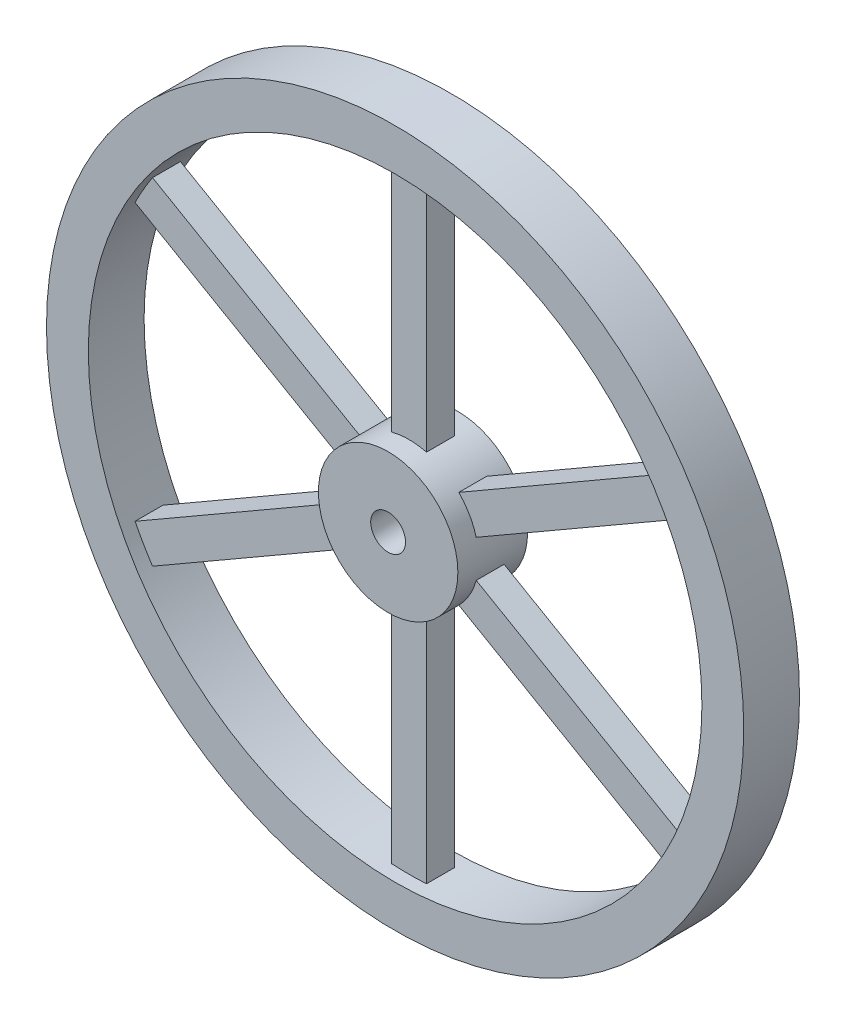
ISO-10303-21;
HEADER;
FILE_DESCRIPTION(('STEP AP214'),'2;1');
FILE_NAME('part.step','',(''),(''),'','','');
FILE_SCHEMA(('AUTOMOTIVE_DESIGN { 1 0 10303 214 1 1 1 1 }'));
ENDSEC;
DATA;
#1=APPLICATION_CONTEXT('core data for automotive mechanical design processes');
#2=APPLICATION_PROTOCOL_DEFINITION('international standard','automotive_design',2000,#1);
#3=PRODUCT_CONTEXT('',#1,'mechanical');
#4=PRODUCT('Part','Part','',(#3));
#5=PRODUCT_RELATED_PRODUCT_CATEGORY('part','',(#4));
#6=PRODUCT_DEFINITION_FORMATION('','',#4);
#7=PRODUCT_DEFINITION_CONTEXT('part definition',#1,'design');
#8=PRODUCT_DEFINITION('design','',#6,#7);
#9=PRODUCT_DEFINITION_SHAPE('','',#8);
#10=(LENGTH_UNIT() NAMED_UNIT(*) SI_UNIT(.MILLI.,.METRE.));
#11=(NAMED_UNIT(*) PLANE_ANGLE_UNIT() SI_UNIT($,.RADIAN.));
#12=(NAMED_UNIT(*) SI_UNIT($,.STERADIAN.) SOLID_ANGLE_UNIT());
#13=UNCERTAINTY_MEASURE_WITH_UNIT(LENGTH_MEASURE(1.E-05),#10,'distance_accuracy_value','');
#14=(GEOMETRIC_REPRESENTATION_CONTEXT(3) GLOBAL_UNCERTAINTY_ASSIGNED_CONTEXT((#13)) GLOBAL_UNIT_ASSIGNED_CONTEXT((#10,
#11,#12)) REPRESENTATION_CONTEXT('',''));
#15=CARTESIAN_POINT('',(0.,0.,0.));
#16=DIRECTION('',(0.,0.,1.));
#17=DIRECTION('',(1.,0.,0.));
#18=AXIS2_PLACEMENT_3D('',#15,#16,#17);
#19=CARTESIAN_POINT('',(-2.5,45.,2.));
#20=DIRECTION('',(1.,0.,0.));
#21=DIRECTION('',(0.,0.,-1.));
#22=AXIS2_PLACEMENT_3D('',#19,#20,#21);
#23=PLANE('',#22);
#24=DIRECTION('',(0.,0.,-1.));
#25=VECTOR('',#24,1.);
#26=CARTESIAN_POINT('',(-2.5,9.68245836551854,5.));
#27=LINE('',#26,#25);
#28=CARTESIAN_POINT('',(-2.5,9.68245836551854,2.));
#29=VERTEX_POINT('',#28);
#30=CARTESIAN_POINT('',(-2.5,9.68245836551854,-2.));
#31=VERTEX_POINT('',#30);
#32=EDGE_CURVE('E306',#29,#31,#27,.T.);
#33=ORIENTED_EDGE('',*,*,#32,.F.);
#34=DIRECTION('',(0.,-1.,0.));
#35=VECTOR('',#34,1.);
#36=CARTESIAN_POINT('',(-2.5,45.,2.));
#37=LINE('',#36,#35);
#38=CARTESIAN_POINT('',(-2.5,43.9289198592453,2.));
#39=VERTEX_POINT('',#38);
#40=EDGE_CURVE('E315',#39,#29,#37,.T.);
#41=ORIENTED_EDGE('',*,*,#40,.F.);
#42=DIRECTION('',(0.,0.,-1.));
#43=VECTOR('',#42,1.);
#44=CARTESIAN_POINT('',(-2.5,43.9289198592453,4.));
#45=LINE('',#44,#43);
#46=CARTESIAN_POINT('',(-2.5,43.9289198592453,-2.));
#47=VERTEX_POINT('',#46);
#48=EDGE_CURVE('E338',#47,#39,#45,.F.);
#49=ORIENTED_EDGE('',*,*,#48,.F.);
#50=DIRECTION('',(0.,-1.,0.));
#51=VECTOR('',#50,1.);
#52=CARTESIAN_POINT('',(-2.5,45.,-2.));
#53=LINE('',#52,#51);
#54=EDGE_CURVE('E313',#47,#31,#53,.T.);
#55=ORIENTED_EDGE('',*,*,#54,.T.);
#56=EDGE_LOOP('',(#33,#41,#49,#55));
#57=FACE_BOUND('',#56,.T.);
#58=ADVANCED_FACE('F41',(#57),#23,.F.);
#59=CARTESIAN_POINT('',(2.5,9.,2.));
#60=DIRECTION('',(-1.,0.,0.));
#61=DIRECTION('',(0.,0.,1.));
#62=AXIS2_PLACEMENT_3D('',#59,#60,#61);
#63=PLANE('',#62);
#64=DIRECTION('',(0.,0.,-1.));
#65=VECTOR('',#64,1.);
#66=CARTESIAN_POINT('',(2.5,9.68245836551854,5.));
#67=LINE('',#66,#65);
#68=CARTESIAN_POINT('',(2.5,9.68245836551854,-2.));
#69=VERTEX_POINT('',#68);
#70=CARTESIAN_POINT('',(2.5,9.68245836551854,2.));
#71=VERTEX_POINT('',#70);
#72=EDGE_CURVE('E224',#69,#71,#67,.F.);
#73=ORIENTED_EDGE('',*,*,#72,.F.);
#74=DIRECTION('',(0.,1.,0.));
#75=VECTOR('',#74,1.);
#76=CARTESIAN_POINT('',(2.5,9.,-2.));
#77=LINE('',#76,#75);
#78=CARTESIAN_POINT('',(2.5,43.9289198592453,-2.));
#79=VERTEX_POINT('',#78);
#80=EDGE_CURVE('E316',#69,#79,#77,.T.);
#81=ORIENTED_EDGE('',*,*,#80,.T.);
#82=DIRECTION('',(0.,0.,-1.));
#83=VECTOR('',#82,1.);
#84=CARTESIAN_POINT('',(2.5,43.9289198592453,4.));
#85=LINE('',#84,#83);
#86=CARTESIAN_POINT('',(2.5,43.9289198592453,2.));
#87=VERTEX_POINT('',#86);
#88=EDGE_CURVE('E339',#87,#79,#85,.T.);
#89=ORIENTED_EDGE('',*,*,#88,.F.);
#90=DIRECTION('',(0.,1.,0.));
#91=VECTOR('',#90,1.);
#92=CARTESIAN_POINT('',(2.5,9.,2.));
#93=LINE('',#92,#91);
#94=EDGE_CURVE('E312',#71,#87,#93,.T.);
#95=ORIENTED_EDGE('',*,*,#94,.F.);
#96=EDGE_LOOP('',(#73,#81,#89,#95));
#97=FACE_BOUND('',#96,.T.);
#98=ADVANCED_FACE('F429',(#97),#63,.F.);
#99=CARTESIAN_POINT('',(0.,0.,4.));
#100=DIRECTION('',(0.,0.,1.));
#101=DIRECTION('',(1.,0.,0.));
#102=AXIS2_PLACEMENT_3D('',#99,#100,#101);
#103=PLANE('',#102);
#104=CARTESIAN_POINT('',(0.,0.,4.));
#105=DIRECTION('',(0.,0.,1.));
#106=DIRECTION('',(1.,0.,0.));
#107=AXIS2_PLACEMENT_3D('',#104,#105,#106);
#108=CIRCLE('',#107,50.);
#109=CARTESIAN_POINT('',(50.,0.,4.));
#110=VERTEX_POINT('',#109);
#111=EDGE_CURVE('E327',#110,#110,#108,.T.);
#112=ORIENTED_EDGE('',*,*,#111,.T.);
#113=EDGE_LOOP('',(#112));
#114=FACE_BOUND('',#113,.T.);
#115=CARTESIAN_POINT('',(0.,0.,4.));
#116=DIRECTION('',(0.,0.,1.));
#117=DIRECTION('',(1.,0.,0.));
#118=AXIS2_PLACEMENT_3D('',#115,#116,#117);
#119=CIRCLE('',#118,44.);
#120=CARTESIAN_POINT('',(44.,0.,4.));
#121=VERTEX_POINT('',#120);
#122=EDGE_CURVE('E325',#121,#121,#119,.T.);
#123=ORIENTED_EDGE('',*,*,#122,.F.);
#124=EDGE_LOOP('',(#123));
#125=FACE_BOUND('',#124,.T.);
#126=ADVANCED_FACE('F440',(#114,#125),#103,.T.);
#127=CARTESIAN_POINT('',(0.,0.,-4.));
#128=DIRECTION('',(0.,0.,1.));
#129=DIRECTION('',(1.,0.,0.));
#130=AXIS2_PLACEMENT_3D('',#127,#128,#129);
#131=PLANE('',#130);
#132=CARTESIAN_POINT('',(0.,0.,-4.));
#133=DIRECTION('',(0.,0.,1.));
#134=DIRECTION('',(1.,0.,0.));
#135=AXIS2_PLACEMENT_3D('',#132,#133,#134);
#136=CIRCLE('',#135,50.);
#137=CARTESIAN_POINT('',(50.,0.,-4.));
#138=VERTEX_POINT('',#137);
#139=EDGE_CURVE('E324',#138,#138,#136,.T.);
#140=ORIENTED_EDGE('',*,*,#139,.F.);
#141=EDGE_LOOP('',(#140));
#142=FACE_BOUND('',#141,.T.);
#143=CARTESIAN_POINT('',(0.,0.,-4.));
#144=DIRECTION('',(0.,0.,1.));
#145=DIRECTION('',(1.,0.,0.));
#146=AXIS2_PLACEMENT_3D('',#143,#144,#145);
#147=CIRCLE('',#146,44.);
#148=CARTESIAN_POINT('',(44.,0.,-4.));
#149=VERTEX_POINT('',#148);
#150=EDGE_CURVE('E318',#149,#149,#147,.T.);
#151=ORIENTED_EDGE('',*,*,#150,.T.);
#152=EDGE_LOOP('',(#151));
#153=FACE_BOUND('',#152,.T.);
#154=ADVANCED_FACE('F446',(#142,#153),#131,.F.);
#155=CARTESIAN_POINT('',(0.,0.,4.));
#156=DIRECTION('',(0.,0.,-1.));
#157=DIRECTION('',(-1.,0.,0.));
#158=AXIS2_PLACEMENT_3D('',#155,#156,#157);
#159=CYLINDRICAL_SURFACE('',#158,50.);
#160=ORIENTED_EDGE('',*,*,#111,.F.);
#161=EDGE_LOOP('',(#160));
#162=FACE_BOUND('',#161,.T.);
#163=ORIENTED_EDGE('',*,*,#139,.T.);
#164=EDGE_LOOP('',(#163));
#165=FACE_BOUND('',#164,.T.);
#166=ADVANCED_FACE('F43',(#162,#165),#159,.T.);
#167=CARTESIAN_POINT('',(0.,0.,4.));
#168=DIRECTION('',(0.,0.,-1.));
#169=DIRECTION('',(-1.,0.,0.));
#170=AXIS2_PLACEMENT_3D('',#167,#168,#169);
#171=CYLINDRICAL_SURFACE('',#170,44.);
#172=CARTESIAN_POINT('',(0.,0.,2.));
#173=DIRECTION('',(0.,0.,1.));
#174=DIRECTION('',(1.,0.,0.));
#175=AXIS2_PLACEMENT_3D('',#172,#173,#174);
#176=CIRCLE('',#175,44.);
#177=CARTESIAN_POINT('',(39.2935605589172,19.7993964201615,2.));
#178=VERTEX_POINT('',#177);
#179=CARTESIAN_POINT('',(36.7935605589172,24.1295234390837,2.));
#180=VERTEX_POINT('',#179);
#181=EDGE_CURVE('E283',#178,#180,#176,.T.);
#182=ORIENTED_EDGE('',*,*,#181,.F.);
#183=DIRECTION('',(0.,0.,-1.));
#184=VECTOR('',#183,1.);
#185=CARTESIAN_POINT('',(39.2935605589172,19.7993964201615,4.));
#186=LINE('',#185,#184);
#187=CARTESIAN_POINT('',(39.2935605589172,19.7993964201615,-2.));
#188=VERTEX_POINT('',#187);
#189=EDGE_CURVE('E287',#178,#188,#186,.T.);
#190=ORIENTED_EDGE('',*,*,#189,.T.);
#191=CARTESIAN_POINT('',(0.,0.,-2.));
#192=DIRECTION('',(0.,0.,1.));
#193=DIRECTION('',(1.,0.,0.));
#194=AXIS2_PLACEMENT_3D('',#191,#192,#193);
#195=CIRCLE('',#194,44.);
#196=CARTESIAN_POINT('',(36.7935605589172,24.1295234390837,-2.));
#197=VERTEX_POINT('',#196);
#198=EDGE_CURVE('E284',#188,#197,#195,.T.);
#199=ORIENTED_EDGE('',*,*,#198,.T.);
#200=DIRECTION('',(0.,0.,-1.));
#201=VECTOR('',#200,1.);
#202=CARTESIAN_POINT('',(36.7935605589172,24.1295234390837,4.));
#203=LINE('',#202,#201);
#204=EDGE_CURVE('E286',#197,#180,#203,.F.);
#205=ORIENTED_EDGE('',*,*,#204,.T.);
#206=EDGE_LOOP('',(#182,#190,#199,#205));
#207=FACE_BOUND('',#206,.T.);
#208=CARTESIAN_POINT('',(0.,0.,2.));
#209=DIRECTION('',(0.,0.,1.));
#210=DIRECTION('',(1.,0.,0.));
#211=AXIS2_PLACEMENT_3D('',#208,#209,#210);
#212=CIRCLE('',#211,44.);
#213=CARTESIAN_POINT('',(36.7935605589172,-24.1295234390838,2.));
#214=VERTEX_POINT('',#213);
#215=CARTESIAN_POINT('',(39.2935605589172,-19.7993964201616,2.));
#216=VERTEX_POINT('',#215);
#217=EDGE_CURVE('E272',#214,#216,#212,.T.);
#218=ORIENTED_EDGE('',*,*,#217,.F.);
#219=DIRECTION('',(0.,0.,-1.));
#220=VECTOR('',#219,1.);
#221=CARTESIAN_POINT('',(36.7935605589172,-24.1295234390838,4.));
#222=LINE('',#221,#220);
#223=CARTESIAN_POINT('',(36.7935605589172,-24.1295234390838,-2.));
#224=VERTEX_POINT('',#223);
#225=EDGE_CURVE('E274',#214,#224,#222,.T.);
#226=ORIENTED_EDGE('',*,*,#225,.T.);
#227=CARTESIAN_POINT('',(0.,0.,-2.));
#228=DIRECTION('',(0.,0.,1.));
#229=DIRECTION('',(1.,0.,0.));
#230=AXIS2_PLACEMENT_3D('',#227,#228,#229);
#231=CIRCLE('',#230,44.);
#232=CARTESIAN_POINT('',(39.2935605589172,-19.7993964201616,-2.));
#233=VERTEX_POINT('',#232);
#234=EDGE_CURVE('E269',#224,#233,#231,.T.);
#235=ORIENTED_EDGE('',*,*,#234,.T.);
#236=DIRECTION('',(0.,0.,-1.));
#237=VECTOR('',#236,1.);
#238=CARTESIAN_POINT('',(39.2935605589172,-19.7993964201616,4.));
#239=LINE('',#238,#237);
#240=EDGE_CURVE('E279',#233,#216,#239,.F.);
#241=ORIENTED_EDGE('',*,*,#240,.T.);
#242=EDGE_LOOP('',(#218,#226,#235,#241));
#243=FACE_BOUND('',#242,.T.);
#244=CARTESIAN_POINT('',(0.,0.,2.));
#245=DIRECTION('',(0.,0.,1.));
#246=DIRECTION('',(1.,0.,0.));
#247=AXIS2_PLACEMENT_3D('',#244,#245,#246);
#248=CIRCLE('',#247,44.);
#249=CARTESIAN_POINT('',(-2.50000000000001,-43.9289198592453,2.));
#250=VERTEX_POINT('',#249);
#251=CARTESIAN_POINT('',(2.49999999999999,-43.9289198592453,2.));
#252=VERTEX_POINT('',#251);
#253=EDGE_CURVE('E265',#250,#252,#248,.T.);
#254=ORIENTED_EDGE('',*,*,#253,.F.);
#255=DIRECTION('',(0.,0.,-1.));
#256=VECTOR('',#255,1.);
#257=CARTESIAN_POINT('',(-2.50000000000001,-43.9289198592453,4.));
#258=LINE('',#257,#256);
#259=CARTESIAN_POINT('',(-2.50000000000001,-43.9289198592453,-2.));
#260=VERTEX_POINT('',#259);
#261=EDGE_CURVE('E262',#250,#260,#258,.T.);
#262=ORIENTED_EDGE('',*,*,#261,.T.);
#263=CARTESIAN_POINT('',(0.,0.,-2.));
#264=DIRECTION('',(0.,0.,1.));
#265=DIRECTION('',(1.,0.,0.));
#266=AXIS2_PLACEMENT_3D('',#263,#264,#265);
#267=CIRCLE('',#266,44.);
#268=CARTESIAN_POINT('',(2.49999999999999,-43.9289198592453,-2.));
#269=VERTEX_POINT('',#268);
#270=EDGE_CURVE('E259',#260,#269,#267,.T.);
#271=ORIENTED_EDGE('',*,*,#270,.T.);
#272=DIRECTION('',(0.,0.,-1.));
#273=VECTOR('',#272,1.);
#274=CARTESIAN_POINT('',(2.49999999999999,-43.9289198592453,4.));
#275=LINE('',#274,#273);
#276=EDGE_CURVE('E270',#269,#252,#275,.F.);
#277=ORIENTED_EDGE('',*,*,#276,.T.);
#278=EDGE_LOOP('',(#254,#262,#271,#277));
#279=FACE_BOUND('',#278,.T.);
#280=CARTESIAN_POINT('',(0.,0.,2.));
#281=DIRECTION('',(0.,0.,1.));
#282=DIRECTION('',(1.,0.,0.));
#283=AXIS2_PLACEMENT_3D('',#280,#281,#282);
#284=CIRCLE('',#283,44.);
#285=CARTESIAN_POINT('',(-39.2935605589172,-19.7993964201616,2.));
#286=VERTEX_POINT('',#285);
#287=CARTESIAN_POINT('',(-36.7935605589172,-24.1295234390838,2.));
#288=VERTEX_POINT('',#287);
#289=EDGE_CURVE('E253',#286,#288,#284,.T.);
#290=ORIENTED_EDGE('',*,*,#289,.F.);
#291=DIRECTION('',(0.,0.,-1.));
#292=VECTOR('',#291,1.);
#293=CARTESIAN_POINT('',(-39.2935605589172,-19.7993964201616,4.));
#294=LINE('',#293,#292);
#295=CARTESIAN_POINT('',(-39.2935605589172,-19.7993964201616,-2.));
#296=VERTEX_POINT('',#295);
#297=EDGE_CURVE('E251',#286,#296,#294,.T.);
#298=ORIENTED_EDGE('',*,*,#297,.T.);
#299=CARTESIAN_POINT('',(0.,0.,-2.));
#300=DIRECTION('',(0.,0.,1.));
#301=DIRECTION('',(1.,0.,0.));
#302=AXIS2_PLACEMENT_3D('',#299,#300,#301);
#303=CIRCLE('',#302,44.);
#304=CARTESIAN_POINT('',(-36.7935605589172,-24.1295234390838,-2.));
#305=VERTEX_POINT('',#304);
#306=EDGE_CURVE('E250',#296,#305,#303,.T.);
#307=ORIENTED_EDGE('',*,*,#306,.T.);
#308=DIRECTION('',(0.,0.,-1.));
#309=VECTOR('',#308,1.);
#310=CARTESIAN_POINT('',(-36.7935605589172,-24.1295234390838,4.));
#311=LINE('',#310,#309);
#312=EDGE_CURVE('E258',#305,#288,#311,.F.);
#313=ORIENTED_EDGE('',*,*,#312,.T.);
#314=EDGE_LOOP('',(#290,#298,#307,#313));
#315=FACE_BOUND('',#314,.T.);
#316=CARTESIAN_POINT('',(0.,0.,2.));
#317=DIRECTION('',(0.,0.,1.));
#318=DIRECTION('',(1.,0.,0.));
#319=AXIS2_PLACEMENT_3D('',#316,#317,#318);
#320=CIRCLE('',#319,44.);
#321=CARTESIAN_POINT('',(-36.7935605589172,24.1295234390838,2.));
#322=VERTEX_POINT('',#321);
#323=CARTESIAN_POINT('',(-39.2935605589172,19.7993964201616,2.));
#324=VERTEX_POINT('',#323);
#325=EDGE_CURVE('E241',#322,#324,#320,.T.);
#326=ORIENTED_EDGE('',*,*,#325,.F.);
#327=DIRECTION('',(0.,0.,-1.));
#328=VECTOR('',#327,1.);
#329=CARTESIAN_POINT('',(-36.7935605589172,24.1295234390838,4.));
#330=LINE('',#329,#328);
#331=CARTESIAN_POINT('',(-36.7935605589172,24.1295234390838,-2.));
#332=VERTEX_POINT('',#331);
#333=EDGE_CURVE('E243',#322,#332,#330,.T.);
#334=ORIENTED_EDGE('',*,*,#333,.T.);
#335=CARTESIAN_POINT('',(0.,0.,-2.));
#336=DIRECTION('',(0.,0.,1.));
#337=DIRECTION('',(1.,0.,0.));
#338=AXIS2_PLACEMENT_3D('',#335,#336,#337);
#339=CIRCLE('',#338,44.);
#340=CARTESIAN_POINT('',(-39.2935605589172,19.7993964201616,-2.));
#341=VERTEX_POINT('',#340);
#342=EDGE_CURVE('E238',#332,#341,#339,.T.);
#343=ORIENTED_EDGE('',*,*,#342,.T.);
#344=DIRECTION('',(0.,0.,-1.));
#345=VECTOR('',#344,1.);
#346=CARTESIAN_POINT('',(-39.2935605589172,19.7993964201616,4.));
#347=LINE('',#346,#345);
#348=EDGE_CURVE('E226',#341,#324,#347,.F.);
#349=ORIENTED_EDGE('',*,*,#348,.T.);
#350=EDGE_LOOP('',(#326,#334,#343,#349));
#351=FACE_BOUND('',#350,.T.);
#352=CARTESIAN_POINT('',(0.,0.,2.));
#353=DIRECTION('',(0.,0.,1.));
#354=DIRECTION('',(1.,0.,0.));
#355=AXIS2_PLACEMENT_3D('',#352,#353,#354);
#356=CIRCLE('',#355,44.);
#357=EDGE_CURVE('E344',#87,#39,#356,.T.);
#358=ORIENTED_EDGE('',*,*,#357,.F.);
#359=ORIENTED_EDGE('',*,*,#88,.T.);
#360=CARTESIAN_POINT('',(0.,0.,-2.));
#361=DIRECTION('',(0.,0.,1.));
#362=DIRECTION('',(1.,0.,0.));
#363=AXIS2_PLACEMENT_3D('',#360,#361,#362);
#364=CIRCLE('',#363,44.);
#365=EDGE_CURVE('E332',#79,#47,#364,.T.);
#366=ORIENTED_EDGE('',*,*,#365,.T.);
#367=ORIENTED_EDGE('',*,*,#48,.T.);
#368=EDGE_LOOP('',(#358,#359,#366,#367));
#369=FACE_BOUND('',#368,.T.);
#370=ORIENTED_EDGE('',*,*,#122,.T.);
#371=EDGE_LOOP('',(#370));
#372=FACE_BOUND('',#371,.T.);
#373=ORIENTED_EDGE('',*,*,#150,.F.);
#374=EDGE_LOOP('',(#373));
#375=FACE_BOUND('',#374,.T.);
#376=ADVANCED_FACE('F418',(#207,#243,#279,#315,#351,#369,#372,#375),#171,.F.);
#377=CARTESIAN_POINT('',(0.,0.,2.));
#378=DIRECTION('',(0.,0.,1.));
#379=DIRECTION('',(1.,0.,0.));
#380=AXIS2_PLACEMENT_3D('',#377,#378,#379);
#381=PLANE('',#380);
#382=ORIENTED_EDGE('',*,*,#40,.T.);
#383=CARTESIAN_POINT('',(0.,0.,2.));
#384=DIRECTION('',(0.,0.,1.));
#385=DIRECTION('',(1.,0.,0.));
#386=AXIS2_PLACEMENT_3D('',#383,#384,#385);
#387=CIRCLE('',#386,10.);
#388=EDGE_CURVE('E303',#29,#71,#387,.F.);
#389=ORIENTED_EDGE('',*,*,#388,.T.);
#390=ORIENTED_EDGE('',*,*,#94,.T.);
#391=ORIENTED_EDGE('',*,*,#357,.T.);
#392=EDGE_LOOP('',(#382,#389,#390,#391));
#393=FACE_BOUND('',#392,.T.);
#394=ADVANCED_FACE('F441',(#393),#381,.T.);
#395=CARTESIAN_POINT('',(0.,0.,-2.));
#396=DIRECTION('',(0.,0.,1.));
#397=DIRECTION('',(1.,0.,0.));
#398=AXIS2_PLACEMENT_3D('',#395,#396,#397);
#399=PLANE('',#398);
#400=CARTESIAN_POINT('',(0.,0.,-2.));
#401=DIRECTION('',(0.,0.,1.));
#402=DIRECTION('',(1.,0.,0.));
#403=AXIS2_PLACEMENT_3D('',#400,#401,#402);
#404=CIRCLE('',#403,10.);
#405=EDGE_CURVE('E297',#31,#69,#404,.F.);
#406=ORIENTED_EDGE('',*,*,#405,.F.);
#407=ORIENTED_EDGE('',*,*,#54,.F.);
#408=ORIENTED_EDGE('',*,*,#365,.F.);
#409=ORIENTED_EDGE('',*,*,#80,.F.);
#410=EDGE_LOOP('',(#406,#407,#408,#409));
#411=FACE_BOUND('',#410,.T.);
#412=ADVANCED_FACE('F490',(#411),#399,.F.);
#413=CARTESIAN_POINT('',(0.,0.,5.));
#414=DIRECTION('',(0.,0.,-1.));
#415=DIRECTION('',(-1.,0.,0.));
#416=AXIS2_PLACEMENT_3D('',#413,#414,#415);
#417=CYLINDRICAL_SURFACE('',#416,10.);
#418=DIRECTION('',(0.,0.,-1.));
#419=VECTOR('',#418,1.);
#420=CARTESIAN_POINT('',(9.63525491562421,2.67616567329817,5.));
#421=LINE('',#420,#419);
#422=CARTESIAN_POINT('',(9.63525491562421,2.67616567329817,2.));
#423=VERTEX_POINT('',#422);
#424=CARTESIAN_POINT('',(9.63525491562421,2.67616567329817,-2.));
#425=VERTEX_POINT('',#424);
#426=EDGE_CURVE('E383',#423,#425,#421,.T.);
#427=ORIENTED_EDGE('',*,*,#426,.F.);
#428=CARTESIAN_POINT('',(0.,0.,2.));
#429=DIRECTION('',(0.,0.,1.));
#430=DIRECTION('',(1.,0.,0.));
#431=AXIS2_PLACEMENT_3D('',#428,#429,#430);
#432=CIRCLE('',#431,10.);
#433=CARTESIAN_POINT('',(7.13525491562422,7.00629269222036,2.));
#434=VERTEX_POINT('',#433);
#435=EDGE_CURVE('E11',#423,#434,#432,.T.);
#436=ORIENTED_EDGE('',*,*,#435,.T.);
#437=DIRECTION('',(0.,0.,-1.));
#438=VECTOR('',#437,1.);
#439=CARTESIAN_POINT('',(7.13525491562422,7.00629269222036,5.));
#440=LINE('',#439,#438);
#441=CARTESIAN_POINT('',(7.13525491562422,7.00629269222036,-2.));
#442=VERTEX_POINT('',#441);
#443=EDGE_CURVE('E47',#442,#434,#440,.F.);
#444=ORIENTED_EDGE('',*,*,#443,.F.);
#445=CARTESIAN_POINT('',(0.,0.,-2.));
#446=DIRECTION('',(0.,0.,1.));
#447=DIRECTION('',(1.,0.,0.));
#448=AXIS2_PLACEMENT_3D('',#445,#446,#447);
#449=CIRCLE('',#448,10.);
#450=EDGE_CURVE('E385',#425,#442,#449,.T.);
#451=ORIENTED_EDGE('',*,*,#450,.F.);
#452=EDGE_LOOP('',(#427,#436,#444,#451));
#453=FACE_BOUND('',#452,.T.);
#454=DIRECTION('',(0.,0.,-1.));
#455=VECTOR('',#454,1.);
#456=CARTESIAN_POINT('',(7.13525491562421,-7.00629269222037,5.));
#457=LINE('',#456,#455);
#458=CARTESIAN_POINT('',(7.13525491562421,-7.00629269222037,2.));
#459=VERTEX_POINT('',#458);
#460=CARTESIAN_POINT('',(7.13525491562421,-7.00629269222037,-2.));
#461=VERTEX_POINT('',#460);
#462=EDGE_CURVE('E372',#459,#461,#457,.T.);
#463=ORIENTED_EDGE('',*,*,#462,.F.);
#464=CARTESIAN_POINT('',(0.,0.,2.));
#465=DIRECTION('',(0.,0.,1.));
#466=DIRECTION('',(1.,0.,0.));
#467=AXIS2_PLACEMENT_3D('',#464,#465,#466);
#468=CIRCLE('',#467,10.);
#469=CARTESIAN_POINT('',(9.63525491562421,-2.67616567329818,2.));
#470=VERTEX_POINT('',#469);
#471=EDGE_CURVE('E379',#459,#470,#468,.T.);
#472=ORIENTED_EDGE('',*,*,#471,.T.);
#473=DIRECTION('',(0.,0.,-1.));
#474=VECTOR('',#473,1.);
#475=CARTESIAN_POINT('',(9.63525491562421,-2.67616567329818,5.));
#476=LINE('',#475,#474);
#477=CARTESIAN_POINT('',(9.63525491562421,-2.67616567329818,-2.));
#478=VERTEX_POINT('',#477);
#479=EDGE_CURVE('E380',#478,#470,#476,.F.);
#480=ORIENTED_EDGE('',*,*,#479,.F.);
#481=CARTESIAN_POINT('',(0.,0.,-2.));
#482=DIRECTION('',(0.,0.,1.));
#483=DIRECTION('',(1.,0.,0.));
#484=AXIS2_PLACEMENT_3D('',#481,#482,#483);
#485=CIRCLE('',#484,10.);
#486=EDGE_CURVE('E375',#461,#478,#485,.T.);
#487=ORIENTED_EDGE('',*,*,#486,.F.);
#488=EDGE_LOOP('',(#463,#472,#480,#487));
#489=FACE_BOUND('',#488,.T.);
#490=DIRECTION('',(0.,0.,-1.));
#491=VECTOR('',#490,1.);
#492=CARTESIAN_POINT('',(-2.5,-9.68245836551854,5.));
#493=LINE('',#492,#491);
#494=CARTESIAN_POINT('',(-2.5,-9.68245836551854,2.));
#495=VERTEX_POINT('',#494);
#496=CARTESIAN_POINT('',(-2.5,-9.68245836551854,-2.));
#497=VERTEX_POINT('',#496);
#498=EDGE_CURVE('E365',#495,#497,#493,.T.);
#499=ORIENTED_EDGE('',*,*,#498,.F.);
#500=CARTESIAN_POINT('',(0.,0.,2.));
#501=DIRECTION('',(0.,0.,1.));
#502=DIRECTION('',(1.,0.,0.));
#503=AXIS2_PLACEMENT_3D('',#500,#501,#502);
#504=CIRCLE('',#503,10.);
#505=CARTESIAN_POINT('',(2.5,-9.68245836551854,2.));
#506=VERTEX_POINT('',#505);
#507=EDGE_CURVE('E367',#495,#506,#504,.T.);
#508=ORIENTED_EDGE('',*,*,#507,.T.);
#509=DIRECTION('',(0.,0.,-1.));
#510=VECTOR('',#509,1.);
#511=CARTESIAN_POINT('',(2.5,-9.68245836551854,5.));
#512=LINE('',#511,#510);
#513=CARTESIAN_POINT('',(2.5,-9.68245836551854,-2.));
#514=VERTEX_POINT('',#513);
#515=EDGE_CURVE('E370',#514,#506,#512,.F.);
#516=ORIENTED_EDGE('',*,*,#515,.F.);
#517=CARTESIAN_POINT('',(0.,0.,-2.));
#518=DIRECTION('',(0.,0.,1.));
#519=DIRECTION('',(1.,0.,0.));
#520=AXIS2_PLACEMENT_3D('',#517,#518,#519);
#521=CIRCLE('',#520,10.);
#522=EDGE_CURVE('E363',#497,#514,#521,.T.);
#523=ORIENTED_EDGE('',*,*,#522,.F.);
#524=EDGE_LOOP('',(#499,#508,#516,#523));
#525=FACE_BOUND('',#524,.T.);
#526=DIRECTION('',(0.,0.,-1.));
#527=VECTOR('',#526,1.);
#528=CARTESIAN_POINT('',(-9.63525491562421,-2.67616567329817,5.));
#529=LINE('',#528,#527);
#530=CARTESIAN_POINT('',(-9.63525491562421,-2.67616567329817,2.));
#531=VERTEX_POINT('',#530);
#532=CARTESIAN_POINT('',(-9.63525491562421,-2.67616567329817,-2.));
#533=VERTEX_POINT('',#532);
#534=EDGE_CURVE('E355',#531,#533,#529,.T.);
#535=ORIENTED_EDGE('',*,*,#534,.F.);
#536=CARTESIAN_POINT('',(0.,0.,2.));
#537=DIRECTION('',(0.,0.,1.));
#538=DIRECTION('',(1.,0.,0.));
#539=AXIS2_PLACEMENT_3D('',#536,#537,#538);
#540=CIRCLE('',#539,10.);
#541=CARTESIAN_POINT('',(-7.13525491562421,-7.00629269222036,2.));
#542=VERTEX_POINT('',#541);
#543=EDGE_CURVE('E356',#531,#542,#540,.T.);
#544=ORIENTED_EDGE('',*,*,#543,.T.);
#545=DIRECTION('',(0.,0.,-1.));
#546=VECTOR('',#545,1.);
#547=CARTESIAN_POINT('',(-7.13525491562421,-7.00629269222036,5.));
#548=LINE('',#547,#546);
#549=CARTESIAN_POINT('',(-7.13525491562421,-7.00629269222037,-2.));
#550=VERTEX_POINT('',#549);
#551=EDGE_CURVE('E357',#550,#542,#548,.F.);
#552=ORIENTED_EDGE('',*,*,#551,.F.);
#553=CARTESIAN_POINT('',(0.,0.,-2.));
#554=DIRECTION('',(0.,0.,1.));
#555=DIRECTION('',(1.,0.,0.));
#556=AXIS2_PLACEMENT_3D('',#553,#554,#555);
#557=CIRCLE('',#556,10.);
#558=EDGE_CURVE('E348',#533,#550,#557,.T.);
#559=ORIENTED_EDGE('',*,*,#558,.F.);
#560=EDGE_LOOP('',(#535,#544,#552,#559));
#561=FACE_BOUND('',#560,.T.);
#562=DIRECTION('',(0.,0.,-1.));
#563=VECTOR('',#562,1.);
#564=CARTESIAN_POINT('',(-7.13525491562421,7.00629269222037,5.));
#565=LINE('',#564,#563);
#566=CARTESIAN_POINT('',(-7.13525491562421,7.00629269222037,2.));
#567=VERTEX_POINT('',#566);
#568=CARTESIAN_POINT('',(-7.13525491562421,7.00629269222037,-2.));
#569=VERTEX_POINT('',#568);
#570=EDGE_CURVE('E212',#567,#569,#565,.T.);
#571=ORIENTED_EDGE('',*,*,#570,.F.);
#572=CARTESIAN_POINT('',(0.,0.,2.));
#573=DIRECTION('',(0.,0.,1.));
#574=DIRECTION('',(1.,0.,0.));
#575=AXIS2_PLACEMENT_3D('',#572,#573,#574);
#576=CIRCLE('',#575,10.);
#577=CARTESIAN_POINT('',(-9.63525491562421,2.67616567329818,2.));
#578=VERTEX_POINT('',#577);
#579=EDGE_CURVE('E207',#567,#578,#576,.T.);
#580=ORIENTED_EDGE('',*,*,#579,.T.);
#581=DIRECTION('',(0.,0.,-1.));
#582=VECTOR('',#581,1.);
#583=CARTESIAN_POINT('',(-9.63525491562421,2.67616567329818,5.));
#584=LINE('',#583,#582);
#585=CARTESIAN_POINT('',(-9.63525491562421,2.67616567329818,-2.));
#586=VERTEX_POINT('',#585);
#587=EDGE_CURVE('E205',#586,#578,#584,.F.);
#588=ORIENTED_EDGE('',*,*,#587,.F.);
#589=CARTESIAN_POINT('',(0.,0.,-2.));
#590=DIRECTION('',(0.,0.,1.));
#591=DIRECTION('',(1.,0.,0.));
#592=AXIS2_PLACEMENT_3D('',#589,#590,#591);
#593=CIRCLE('',#592,10.);
#594=EDGE_CURVE('E206',#569,#586,#593,.T.);
#595=ORIENTED_EDGE('',*,*,#594,.F.);
#596=EDGE_LOOP('',(#571,#580,#588,#595));
#597=FACE_BOUND('',#596,.T.);
#598=CARTESIAN_POINT('',(0.,0.,5.));
#599=DIRECTION('',(0.,0.,1.));
#600=DIRECTION('',(1.,0.,0.));
#601=AXIS2_PLACEMENT_3D('',#598,#599,#600);
#602=CIRCLE('',#601,10.);
#603=CARTESIAN_POINT('',(10.,0.,5.));
#604=VERTEX_POINT('',#603);
#605=EDGE_CURVE('E296',#604,#604,#602,.T.);
#606=ORIENTED_EDGE('',*,*,#605,.F.);
#607=EDGE_LOOP('',(#606));
#608=FACE_BOUND('',#607,.T.);
#609=CARTESIAN_POINT('',(0.,0.,-5.));
#610=DIRECTION('',(0.,0.,1.));
#611=DIRECTION('',(1.,0.,0.));
#612=AXIS2_PLACEMENT_3D('',#609,#610,#611);
#613=CIRCLE('',#612,10.);
#614=CARTESIAN_POINT('',(10.,0.,-5.));
#615=VERTEX_POINT('',#614);
#616=EDGE_CURVE('E299',#615,#615,#613,.T.);
#617=ORIENTED_EDGE('',*,*,#616,.T.);
#618=EDGE_LOOP('',(#617));
#619=FACE_BOUND('',#618,.T.);
#620=ORIENTED_EDGE('',*,*,#388,.F.);
#621=ORIENTED_EDGE('',*,*,#32,.T.);
#622=ORIENTED_EDGE('',*,*,#405,.T.);
#623=ORIENTED_EDGE('',*,*,#72,.T.);
#624=EDGE_LOOP('',(#620,#621,#622,#623));
#625=FACE_BOUND('',#624,.T.);
#626=ADVANCED_FACE('F204',(#453,#489,#525,#561,#597,#608,#619,#625),#417,.T.);
#627=CARTESIAN_POINT('',(0.,0.,5.));
#628=DIRECTION('',(0.,0.,1.));
#629=DIRECTION('',(1.,0.,0.));
#630=AXIS2_PLACEMENT_3D('',#627,#628,#629);
#631=PLANE('',#630);
#632=CARTESIAN_POINT('',(0.,0.,5.));
#633=DIRECTION('',(0.,0.,1.));
#634=DIRECTION('',(1.,0.,0.));
#635=AXIS2_PLACEMENT_3D('',#632,#633,#634);
#636=CIRCLE('',#635,2.5);
#637=CARTESIAN_POINT('',(2.5,0.,5.));
#638=VERTEX_POINT('',#637);
#639=EDGE_CURVE('E291',#638,#638,#636,.T.);
#640=ORIENTED_EDGE('',*,*,#639,.F.);
#641=EDGE_LOOP('',(#640));
#642=FACE_BOUND('',#641,.T.);
#643=ORIENTED_EDGE('',*,*,#605,.T.);
#644=EDGE_LOOP('',(#643));
#645=FACE_BOUND('',#644,.T.);
#646=ADVANCED_FACE('F486',(#642,#645),#631,.T.);
#647=CARTESIAN_POINT('',(0.,0.,-5.));
#648=DIRECTION('',(0.,0.,1.));
#649=DIRECTION('',(1.,0.,0.));
#650=AXIS2_PLACEMENT_3D('',#647,#648,#649);
#651=PLANE('',#650);
#652=CARTESIAN_POINT('',(0.,0.,-5.));
#653=DIRECTION('',(0.,0.,1.));
#654=DIRECTION('',(1.,0.,0.));
#655=AXIS2_PLACEMENT_3D('',#652,#653,#654);
#656=CIRCLE('',#655,2.5);
#657=CARTESIAN_POINT('',(2.5,0.,-5.));
#658=VERTEX_POINT('',#657);
#659=EDGE_CURVE('E295',#658,#658,#656,.T.);
#660=ORIENTED_EDGE('',*,*,#659,.T.);
#661=EDGE_LOOP('',(#660));
#662=FACE_BOUND('',#661,.T.);
#663=ORIENTED_EDGE('',*,*,#616,.F.);
#664=EDGE_LOOP('',(#663));
#665=FACE_BOUND('',#664,.T.);
#666=ADVANCED_FACE('F497',(#662,#665),#651,.F.);
#667=CARTESIAN_POINT('',(0.,0.,-6.));
#668=DIRECTION('',(0.,0.,1.));
#669=DIRECTION('',(1.,0.,0.));
#670=AXIS2_PLACEMENT_3D('',#667,#668,#669);
#671=CYLINDRICAL_SURFACE('',#670,2.5);
#672=ORIENTED_EDGE('',*,*,#639,.T.);
#673=EDGE_LOOP('',(#672));
#674=FACE_BOUND('',#673,.T.);
#675=ORIENTED_EDGE('',*,*,#659,.F.);
#676=EDGE_LOOP('',(#675));
#677=FACE_BOUND('',#676,.T.);
#678=ADVANCED_FACE('F426',(#674,#677),#671,.F.);
#679=CARTESIAN_POINT('',(-40.2211431702997,20.3349364905389,2.));
#680=DIRECTION('',(0.5,0.866025403784439,0.));
#681=DIRECTION('',(-0.866025403784439,0.5,0.));
#682=AXIS2_PLACEMENT_3D('',#679,#680,#681);
#683=PLANE('',#682);
#684=ORIENTED_EDGE('',*,*,#348,.F.);
#685=DIRECTION('',(0.866025403784439,-0.5,0.));
#686=VECTOR('',#685,1.);
#687=CARTESIAN_POINT('',(-40.2211431702997,20.3349364905389,-2.));
#688=LINE('',#687,#686);
#689=EDGE_CURVE('E218',#341,#586,#688,.T.);
#690=ORIENTED_EDGE('',*,*,#689,.T.);
#691=ORIENTED_EDGE('',*,*,#587,.T.);
#692=DIRECTION('',(0.866025403784439,-0.5,0.));
#693=VECTOR('',#692,1.);
#694=CARTESIAN_POINT('',(-40.2211431702997,20.3349364905389,2.));
#695=LINE('',#694,#693);
#696=EDGE_CURVE('E232',#324,#578,#695,.T.);
#697=ORIENTED_EDGE('',*,*,#696,.F.);
#698=EDGE_LOOP('',(#684,#690,#691,#697));
#699=FACE_BOUND('',#698,.T.);
#700=ADVANCED_FACE('F223',(#699),#683,.F.);
#701=CARTESIAN_POINT('',(-6.54422863405995,6.6650635094611,2.));
#702=DIRECTION('',(-0.5,-0.866025403784439,0.));
#703=DIRECTION('',(0.866025403784439,-0.5,0.));
#704=AXIS2_PLACEMENT_3D('',#701,#702,#703);
#705=PLANE('',#704);
#706=ORIENTED_EDGE('',*,*,#333,.F.);
#707=DIRECTION('',(-0.866025403784439,0.5,0.));
#708=VECTOR('',#707,1.);
#709=CARTESIAN_POINT('',(-6.54422863405995,6.6650635094611,2.));
#710=LINE('',#709,#708);
#711=EDGE_CURVE('E240',#567,#322,#710,.T.);
#712=ORIENTED_EDGE('',*,*,#711,.F.);
#713=ORIENTED_EDGE('',*,*,#570,.T.);
#714=DIRECTION('',(-0.866025403784439,0.5,0.));
#715=VECTOR('',#714,1.);
#716=CARTESIAN_POINT('',(-6.54422863405995,6.6650635094611,-2.));
#717=LINE('',#716,#715);
#718=EDGE_CURVE('E225',#569,#332,#717,.T.);
#719=ORIENTED_EDGE('',*,*,#718,.T.);
#720=EDGE_LOOP('',(#706,#712,#713,#719));
#721=FACE_BOUND('',#720,.T.);
#722=ADVANCED_FACE('F416',(#721),#705,.F.);
#723=CARTESIAN_POINT('',(0.,0.,2.));
#724=DIRECTION('',(0.,0.,1.));
#725=DIRECTION('',(0.5,0.866025403784439,0.));
#726=AXIS2_PLACEMENT_3D('',#723,#724,#725);
#727=PLANE('',#726);
#728=ORIENTED_EDGE('',*,*,#711,.T.);
#729=ORIENTED_EDGE('',*,*,#325,.T.);
#730=ORIENTED_EDGE('',*,*,#696,.T.);
#731=ORIENTED_EDGE('',*,*,#579,.F.);
#732=EDGE_LOOP('',(#728,#729,#730,#731));
#733=FACE_BOUND('',#732,.T.);
#734=ADVANCED_FACE('F415',(#733),#727,.T.);
#735=CARTESIAN_POINT('',(0.,0.,-2.));
#736=DIRECTION('',(0.,0.,1.));
#737=DIRECTION('',(0.5,0.866025403784439,0.));
#738=AXIS2_PLACEMENT_3D('',#735,#736,#737);
#739=PLANE('',#738);
#740=ORIENTED_EDGE('',*,*,#342,.F.);
#741=ORIENTED_EDGE('',*,*,#718,.F.);
#742=ORIENTED_EDGE('',*,*,#594,.T.);
#743=ORIENTED_EDGE('',*,*,#689,.F.);
#744=EDGE_LOOP('',(#740,#741,#742,#743));
#745=FACE_BOUND('',#744,.T.);
#746=ADVANCED_FACE('F217',(#745),#739,.F.);
#747=CARTESIAN_POINT('',(-37.7211431702998,-24.6650635094611,2.));
#748=DIRECTION('',(-0.5,0.866025403784439,0.));
#749=DIRECTION('',(-0.866025403784439,-0.5,0.));
#750=AXIS2_PLACEMENT_3D('',#747,#748,#749);
#751=PLANE('',#750);
#752=ORIENTED_EDGE('',*,*,#312,.F.);
#753=DIRECTION('',(0.866025403784439,0.5,0.));
#754=VECTOR('',#753,1.);
#755=CARTESIAN_POINT('',(-37.7211431702998,-24.6650635094611,-2.));
#756=LINE('',#755,#754);
#757=EDGE_CURVE('E733',#305,#550,#756,.T.);
#758=ORIENTED_EDGE('',*,*,#757,.T.);
#759=ORIENTED_EDGE('',*,*,#551,.T.);
#760=DIRECTION('',(0.866025403784439,0.5,0.));
#761=VECTOR('',#760,1.);
#762=CARTESIAN_POINT('',(-37.7211431702998,-24.6650635094611,2.));
#763=LINE('',#762,#761);
#764=EDGE_CURVE('E231',#288,#542,#763,.T.);
#765=ORIENTED_EDGE('',*,*,#764,.F.);
#766=EDGE_LOOP('',(#752,#758,#759,#765));
#767=FACE_BOUND('',#766,.T.);
#768=ADVANCED_FACE('F561',(#767),#751,.F.);
#769=CARTESIAN_POINT('',(-9.04422863405995,-2.3349364905389,2.));
#770=DIRECTION('',(0.5,-0.866025403784439,0.));
#771=DIRECTION('',(0.866025403784439,0.5,0.));
#772=AXIS2_PLACEMENT_3D('',#769,#770,#771);
#773=PLANE('',#772);
#774=ORIENTED_EDGE('',*,*,#297,.F.);
#775=DIRECTION('',(-0.866025403784439,-0.5,0.));
#776=VECTOR('',#775,1.);
#777=CARTESIAN_POINT('',(-9.04422863405995,-2.3349364905389,2.));
#778=LINE('',#777,#776);
#779=EDGE_CURVE('E228',#531,#286,#778,.T.);
#780=ORIENTED_EDGE('',*,*,#779,.F.);
#781=ORIENTED_EDGE('',*,*,#534,.T.);
#782=DIRECTION('',(-0.866025403784439,-0.5,0.));
#783=VECTOR('',#782,1.);
#784=CARTESIAN_POINT('',(-9.04422863405995,-2.3349364905389,-2.));
#785=LINE('',#784,#783);
#786=EDGE_CURVE('E735',#533,#296,#785,.T.);
#787=ORIENTED_EDGE('',*,*,#786,.T.);
#788=EDGE_LOOP('',(#774,#780,#781,#787));
#789=FACE_BOUND('',#788,.T.);
#790=ADVANCED_FACE('F571',(#789),#773,.F.);
#791=CARTESIAN_POINT('',(0.,0.,2.));
#792=DIRECTION('',(0.,0.,1.));
#793=DIRECTION('',(-0.5,0.866025403784439,0.));
#794=AXIS2_PLACEMENT_3D('',#791,#792,#793);
#795=PLANE('',#794);
#796=ORIENTED_EDGE('',*,*,#779,.T.);
#797=ORIENTED_EDGE('',*,*,#289,.T.);
#798=ORIENTED_EDGE('',*,*,#764,.T.);
#799=ORIENTED_EDGE('',*,*,#543,.F.);
#800=EDGE_LOOP('',(#796,#797,#798,#799));
#801=FACE_BOUND('',#800,.T.);
#802=ADVANCED_FACE('F582',(#801),#795,.T.);
#803=CARTESIAN_POINT('',(0.,0.,-2.));
#804=DIRECTION('',(0.,0.,1.));
#805=DIRECTION('',(-0.5,0.866025403784439,0.));
#806=AXIS2_PLACEMENT_3D('',#803,#804,#805);
#807=PLANE('',#806);
#808=ORIENTED_EDGE('',*,*,#306,.F.);
#809=ORIENTED_EDGE('',*,*,#786,.F.);
#810=ORIENTED_EDGE('',*,*,#558,.T.);
#811=ORIENTED_EDGE('',*,*,#757,.F.);
#812=EDGE_LOOP('',(#808,#809,#810,#811));
#813=FACE_BOUND('',#812,.T.);
#814=ADVANCED_FACE('F595',(#813),#807,.F.);
#815=CARTESIAN_POINT('',(2.49999999999999,-45.,2.));
#816=DIRECTION('',(-1.,0.,0.));
#817=DIRECTION('',(0.,-1.,0.));
#818=AXIS2_PLACEMENT_3D('',#815,#816,#817);
#819=PLANE('',#818);
#820=ORIENTED_EDGE('',*,*,#276,.F.);
#821=DIRECTION('',(0.,1.,0.));
#822=VECTOR('',#821,1.);
#823=CARTESIAN_POINT('',(2.49999999999999,-45.,-2.));
#824=LINE('',#823,#822);
#825=EDGE_CURVE('E748',#269,#514,#824,.T.);
#826=ORIENTED_EDGE('',*,*,#825,.T.);
#827=ORIENTED_EDGE('',*,*,#515,.T.);
#828=DIRECTION('',(0.,1.,0.));
#829=VECTOR('',#828,1.);
#830=CARTESIAN_POINT('',(2.49999999999999,-45.,2.));
#831=LINE('',#830,#829);
#832=EDGE_CURVE('E737',#252,#506,#831,.T.);
#833=ORIENTED_EDGE('',*,*,#832,.F.);
#834=EDGE_LOOP('',(#820,#826,#827,#833));
#835=FACE_BOUND('',#834,.T.);
#836=ADVANCED_FACE('F605',(#835),#819,.F.);
#837=CARTESIAN_POINT('',(-2.5,-9.,2.));
#838=DIRECTION('',(1.,0.,0.));
#839=DIRECTION('',(0.,1.,0.));
#840=AXIS2_PLACEMENT_3D('',#837,#838,#839);
#841=PLANE('',#840);
#842=ORIENTED_EDGE('',*,*,#261,.F.);
#843=DIRECTION('',(0.,-1.,0.));
#844=VECTOR('',#843,1.);
#845=CARTESIAN_POINT('',(-2.5,-9.,2.));
#846=LINE('',#845,#844);
#847=EDGE_CURVE('E740',#495,#250,#846,.T.);
#848=ORIENTED_EDGE('',*,*,#847,.F.);
#849=ORIENTED_EDGE('',*,*,#498,.T.);
#850=DIRECTION('',(0.,-1.,0.));
#851=VECTOR('',#850,1.);
#852=CARTESIAN_POINT('',(-2.5,-9.,-2.));
#853=LINE('',#852,#851);
#854=EDGE_CURVE('E745',#497,#260,#853,.T.);
#855=ORIENTED_EDGE('',*,*,#854,.T.);
#856=EDGE_LOOP('',(#842,#848,#849,#855));
#857=FACE_BOUND('',#856,.T.);
#858=ADVANCED_FACE('F611',(#857),#841,.F.);
#859=CARTESIAN_POINT('',(0.,0.,2.));
#860=DIRECTION('',(0.,0.,1.));
#861=DIRECTION('',(-1.,0.,0.));
#862=AXIS2_PLACEMENT_3D('',#859,#860,#861);
#863=PLANE('',#862);
#864=ORIENTED_EDGE('',*,*,#847,.T.);
#865=ORIENTED_EDGE('',*,*,#253,.T.);
#866=ORIENTED_EDGE('',*,*,#832,.T.);
#867=ORIENTED_EDGE('',*,*,#507,.F.);
#868=EDGE_LOOP('',(#864,#865,#866,#867));
#869=FACE_BOUND('',#868,.T.);
#870=ADVANCED_FACE('F625',(#869),#863,.T.);
#871=CARTESIAN_POINT('',(0.,0.,-2.));
#872=DIRECTION('',(0.,0.,1.));
#873=DIRECTION('',(-1.,0.,0.));
#874=AXIS2_PLACEMENT_3D('',#871,#872,#873);
#875=PLANE('',#874);
#876=ORIENTED_EDGE('',*,*,#270,.F.);
#877=ORIENTED_EDGE('',*,*,#854,.F.);
#878=ORIENTED_EDGE('',*,*,#522,.T.);
#879=ORIENTED_EDGE('',*,*,#825,.F.);
#880=EDGE_LOOP('',(#876,#877,#878,#879));
#881=FACE_BOUND('',#880,.T.);
#882=ADVANCED_FACE('F634',(#881),#875,.F.);
#883=CARTESIAN_POINT('',(40.2211431702997,-20.3349364905389,2.));
#884=DIRECTION('',(-0.5,-0.866025403784438,0.));
#885=DIRECTION('',(0.866025403784438,-0.5,0.));
#886=AXIS2_PLACEMENT_3D('',#883,#884,#885);
#887=PLANE('',#886);
#888=ORIENTED_EDGE('',*,*,#240,.F.);
#889=DIRECTION('',(-0.866025403784438,0.5,0.));
#890=VECTOR('',#889,1.);
#891=CARTESIAN_POINT('',(40.2211431702997,-20.3349364905389,-2.));
#892=LINE('',#891,#890);
#893=EDGE_CURVE('E63',#233,#478,#892,.T.);
#894=ORIENTED_EDGE('',*,*,#893,.T.);
#895=ORIENTED_EDGE('',*,*,#479,.T.);
#896=DIRECTION('',(-0.866025403784438,0.5,0.));
#897=VECTOR('',#896,1.);
#898=CARTESIAN_POINT('',(40.2211431702997,-20.3349364905389,2.));
#899=LINE('',#898,#897);
#900=EDGE_CURVE('E755',#216,#470,#899,.T.);
#901=ORIENTED_EDGE('',*,*,#900,.F.);
#902=EDGE_LOOP('',(#888,#894,#895,#901));
#903=FACE_BOUND('',#902,.T.);
#904=ADVANCED_FACE('F645',(#903),#887,.F.);
#905=CARTESIAN_POINT('',(6.54422863405994,-6.6650635094611,2.));
#906=DIRECTION('',(0.5,0.866025403784438,0.));
#907=DIRECTION('',(-0.866025403784438,0.5,0.));
#908=AXIS2_PLACEMENT_3D('',#905,#906,#907);
#909=PLANE('',#908);
#910=ORIENTED_EDGE('',*,*,#225,.F.);
#911=DIRECTION('',(0.866025403784438,-0.5,0.));
#912=VECTOR('',#911,1.);
#913=CARTESIAN_POINT('',(6.54422863405994,-6.6650635094611,2.));
#914=LINE('',#913,#912);
#915=EDGE_CURVE('E750',#459,#214,#914,.T.);
#916=ORIENTED_EDGE('',*,*,#915,.F.);
#917=ORIENTED_EDGE('',*,*,#462,.T.);
#918=DIRECTION('',(0.866025403784438,-0.5,0.));
#919=VECTOR('',#918,1.);
#920=CARTESIAN_POINT('',(6.54422863405994,-6.6650635094611,-2.));
#921=LINE('',#920,#919);
#922=EDGE_CURVE('E409',#461,#224,#921,.T.);
#923=ORIENTED_EDGE('',*,*,#922,.T.);
#924=EDGE_LOOP('',(#910,#916,#917,#923));
#925=FACE_BOUND('',#924,.T.);
#926=ADVANCED_FACE('F655',(#925),#909,.F.);
#927=CARTESIAN_POINT('',(0.,0.,2.));
#928=DIRECTION('',(0.,0.,1.));
#929=DIRECTION('',(-0.5,-0.866025403784438,0.));
#930=AXIS2_PLACEMENT_3D('',#927,#928,#929);
#931=PLANE('',#930);
#932=ORIENTED_EDGE('',*,*,#915,.T.);
#933=ORIENTED_EDGE('',*,*,#217,.T.);
#934=ORIENTED_EDGE('',*,*,#900,.T.);
#935=ORIENTED_EDGE('',*,*,#471,.F.);
#936=EDGE_LOOP('',(#932,#933,#934,#935));
#937=FACE_BOUND('',#936,.T.);
#938=ADVANCED_FACE('F665',(#937),#931,.T.);
#939=CARTESIAN_POINT('',(0.,0.,-2.));
#940=DIRECTION('',(0.,0.,1.));
#941=DIRECTION('',(-0.5,-0.866025403784438,0.));
#942=AXIS2_PLACEMENT_3D('',#939,#940,#941);
#943=PLANE('',#942);
#944=ORIENTED_EDGE('',*,*,#234,.F.);
#945=ORIENTED_EDGE('',*,*,#922,.F.);
#946=ORIENTED_EDGE('',*,*,#486,.T.);
#947=ORIENTED_EDGE('',*,*,#893,.F.);
#948=EDGE_LOOP('',(#944,#945,#946,#947));
#949=FACE_BOUND('',#948,.T.);
#950=ADVANCED_FACE('F674',(#949),#943,.F.);
#951=CARTESIAN_POINT('',(37.7211431702998,24.6650635094611,2.));
#952=DIRECTION('',(0.499999999999999,-0.866025403784439,0.));
#953=DIRECTION('',(0.866025403784439,0.499999999999999,0.));
#954=AXIS2_PLACEMENT_3D('',#951,#952,#953);
#955=PLANE('',#954);
#956=ORIENTED_EDGE('',*,*,#204,.F.);
#957=DIRECTION('',(-0.866025403784439,-0.499999999999999,0.));
#958=VECTOR('',#957,1.);
#959=CARTESIAN_POINT('',(37.7211431702998,24.6650635094611,-2.));
#960=LINE('',#959,#958);
#961=EDGE_CURVE('E57',#197,#442,#960,.T.);
#962=ORIENTED_EDGE('',*,*,#961,.T.);
#963=ORIENTED_EDGE('',*,*,#443,.T.);
#964=DIRECTION('',(-0.866025403784439,-0.499999999999999,0.));
#965=VECTOR('',#964,1.);
#966=CARTESIAN_POINT('',(37.7211431702998,24.6650635094611,2.));
#967=LINE('',#966,#965);
#968=EDGE_CURVE('E394',#180,#434,#967,.T.);
#969=ORIENTED_EDGE('',*,*,#968,.F.);
#970=EDGE_LOOP('',(#956,#962,#963,#969));
#971=FACE_BOUND('',#970,.T.);
#972=ADVANCED_FACE('F388',(#971),#955,.F.);
#973=CARTESIAN_POINT('',(9.04422863405995,2.3349364905389,2.));
#974=DIRECTION('',(-0.499999999999999,0.866025403784439,0.));
#975=DIRECTION('',(-0.866025403784439,-0.499999999999999,0.));
#976=AXIS2_PLACEMENT_3D('',#973,#974,#975);
#977=PLANE('',#976);
#978=ORIENTED_EDGE('',*,*,#189,.F.);
#979=DIRECTION('',(0.866025403784439,0.499999999999999,0.));
#980=VECTOR('',#979,1.);
#981=CARTESIAN_POINT('',(9.04422863405995,2.3349364905389,2.));
#982=LINE('',#981,#980);
#983=EDGE_CURVE('E396',#423,#178,#982,.T.);
#984=ORIENTED_EDGE('',*,*,#983,.F.);
#985=ORIENTED_EDGE('',*,*,#426,.T.);
#986=DIRECTION('',(0.866025403784439,0.499999999999999,0.));
#987=VECTOR('',#986,1.);
#988=CARTESIAN_POINT('',(9.04422863405995,2.3349364905389,-2.));
#989=LINE('',#988,#987);
#990=EDGE_CURVE('E398',#425,#188,#989,.T.);
#991=ORIENTED_EDGE('',*,*,#990,.T.);
#992=EDGE_LOOP('',(#978,#984,#985,#991));
#993=FACE_BOUND('',#992,.T.);
#994=ADVANCED_FACE('F688',(#993),#977,.F.);
#995=CARTESIAN_POINT('',(0.,0.,2.));
#996=DIRECTION('',(0.,0.,1.));
#997=DIRECTION('',(0.499999999999999,-0.866025403784439,0.));
#998=AXIS2_PLACEMENT_3D('',#995,#996,#997);
#999=PLANE('',#998);
#1000=ORIENTED_EDGE('',*,*,#983,.T.);
#1001=ORIENTED_EDGE('',*,*,#181,.T.);
#1002=ORIENTED_EDGE('',*,*,#968,.T.);
#1003=ORIENTED_EDGE('',*,*,#435,.F.);
#1004=EDGE_LOOP('',(#1000,#1001,#1002,#1003));
#1005=FACE_BOUND('',#1004,.T.);
#1006=ADVANCED_FACE('F397',(#1005),#999,.T.);
#1007=CARTESIAN_POINT('',(0.,0.,-2.));
#1008=DIRECTION('',(0.,0.,1.));
#1009=DIRECTION('',(0.499999999999999,-0.866025403784439,0.));
#1010=AXIS2_PLACEMENT_3D('',#1007,#1008,#1009);
#1011=PLANE('',#1010);
#1012=ORIENTED_EDGE('',*,*,#198,.F.);
#1013=ORIENTED_EDGE('',*,*,#990,.F.);
#1014=ORIENTED_EDGE('',*,*,#450,.T.);
#1015=ORIENTED_EDGE('',*,*,#961,.F.);
#1016=EDGE_LOOP('',(#1012,#1013,#1014,#1015));
#1017=FACE_BOUND('',#1016,.T.);
#1018=ADVANCED_FACE('F708',(#1017),#1011,.F.);
#1019=CLOSED_SHELL('',(#58,#98,#126,#154,#166,#376,#394,#412,#626,#646,#666,#678,#700,#722,#734,
#746,#768,#790,#802,#814,#836,#858,#870,#882,#904,#926,#938,#950,#972,#994,#1006,#1018));
#1020=MANIFOLD_SOLID_BREP('B2',#1019);
#1021=ADVANCED_BREP_SHAPE_REPRESENTATION('',(#18,#1020),#14);
#1022=SHAPE_DEFINITION_REPRESENTATION(#9,#1021);
ENDSEC;
END-ISO-10303-21;
